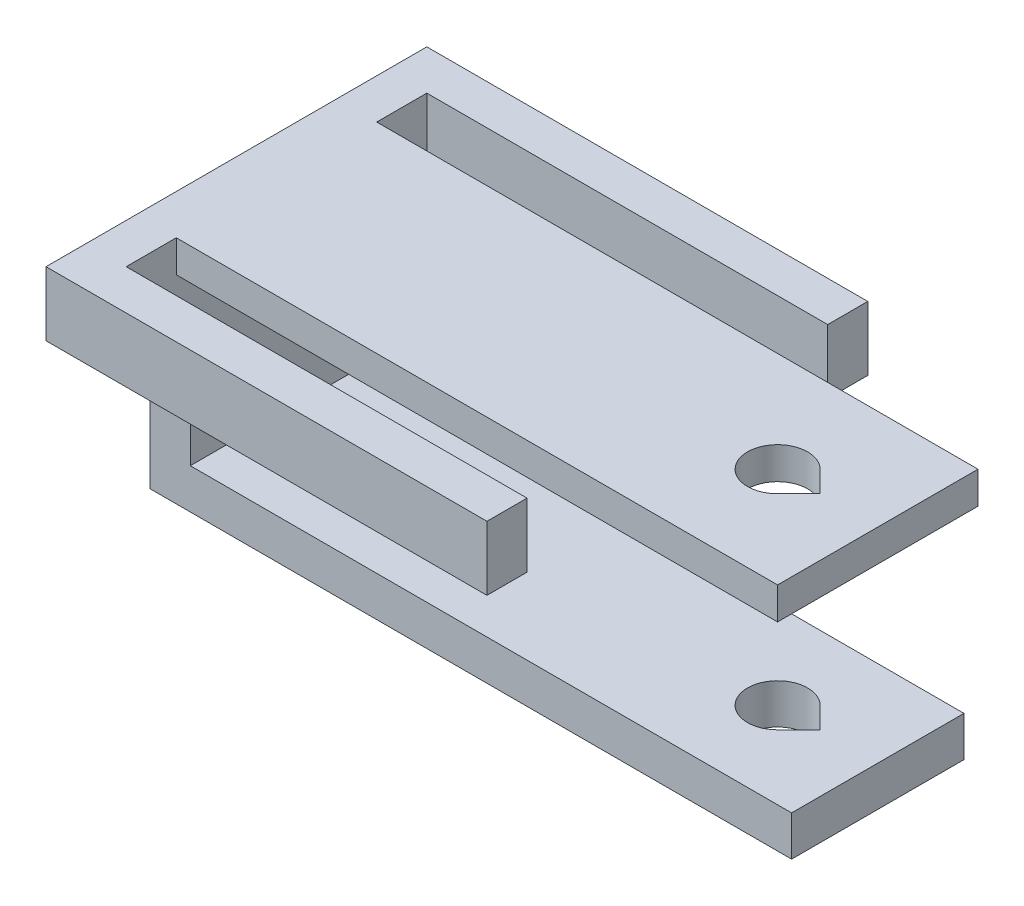
ISO-10303-21;
HEADER;
FILE_DESCRIPTION(('STEP AP214'),'2;1');
FILE_NAME('part.step','',(''),(''),'','','');
FILE_SCHEMA(('AUTOMOTIVE_DESIGN { 1 0 10303 214 1 1 1 1 }'));
ENDSEC;
DATA;
#1=APPLICATION_CONTEXT('core data for automotive mechanical design processes');
#2=APPLICATION_PROTOCOL_DEFINITION('international standard','automotive_design',2000,#1);
#3=PRODUCT_CONTEXT('',#1,'mechanical');
#4=PRODUCT('Part','Part','',(#3));
#5=PRODUCT_RELATED_PRODUCT_CATEGORY('part','',(#4));
#6=PRODUCT_DEFINITION_FORMATION('','',#4);
#7=PRODUCT_DEFINITION_CONTEXT('part definition',#1,'design');
#8=PRODUCT_DEFINITION('design','',#6,#7);
#9=PRODUCT_DEFINITION_SHAPE('','',#8);
#10=(LENGTH_UNIT() NAMED_UNIT(*) SI_UNIT(.MILLI.,.METRE.));
#11=(NAMED_UNIT(*) PLANE_ANGLE_UNIT() SI_UNIT($,.RADIAN.));
#12=(NAMED_UNIT(*) SI_UNIT($,.STERADIAN.) SOLID_ANGLE_UNIT());
#13=UNCERTAINTY_MEASURE_WITH_UNIT(LENGTH_MEASURE(1.E-05),#10,'distance_accuracy_value','');
#14=(GEOMETRIC_REPRESENTATION_CONTEXT(3) GLOBAL_UNCERTAINTY_ASSIGNED_CONTEXT((#13)) GLOBAL_UNIT_ASSIGNED_CONTEXT((#10,
#11,#12)) REPRESENTATION_CONTEXT('',''));
#15=CARTESIAN_POINT('',(0.,0.,0.));
#16=DIRECTION('',(0.,0.,1.));
#17=DIRECTION('',(1.,0.,0.));
#18=AXIS2_PLACEMENT_3D('',#15,#16,#17);
#19=CARTESIAN_POINT('',(0.,0.,0.));
#20=DIRECTION('',(-1.,0.,0.));
#21=DIRECTION('',(0.,0.,1.));
#22=AXIS2_PLACEMENT_3D('',#19,#20,#21);
#23=PLANE('',#22);
#24=DIRECTION('',(0.,0.,1.));
#25=VECTOR('',#24,1.);
#26=CARTESIAN_POINT('',(0.,-8.6,-0.700000000000001));
#27=LINE('',#26,#25);
#28=CARTESIAN_POINT('',(0.,-8.6,-9.3));
#29=VERTEX_POINT('',#28);
#30=CARTESIAN_POINT('',(0.,-8.6,-0.700000000000001));
#31=VERTEX_POINT('',#30);
#32=EDGE_CURVE('E261',#29,#31,#27,.T.);
#33=ORIENTED_EDGE('',*,*,#32,.F.);
#34=DIRECTION('',(0.,-1.,0.));
#35=VECTOR('',#34,1.);
#36=CARTESIAN_POINT('',(0.,-1.6,-9.3));
#37=LINE('',#36,#35);
#38=CARTESIAN_POINT('',(0.,-1.6,-9.3));
#39=VERTEX_POINT('',#38);
#40=EDGE_CURVE('E323',#39,#29,#37,.T.);
#41=ORIENTED_EDGE('',*,*,#40,.F.);
#42=DIRECTION('',(0.,0.,1.));
#43=VECTOR('',#42,1.);
#44=CARTESIAN_POINT('',(0.,-1.6,-14.5));
#45=LINE('',#44,#43);
#46=CARTESIAN_POINT('',(0.,-1.6,-12.5));
#47=VERTEX_POINT('',#46);
#48=EDGE_CURVE('E302',#47,#39,#45,.T.);
#49=ORIENTED_EDGE('',*,*,#48,.F.);
#50=DIRECTION('',(0.,-1.,0.));
#51=VECTOR('',#50,1.);
#52=CARTESIAN_POINT('',(0.,1.6,-12.5));
#53=LINE('',#52,#51);
#54=CARTESIAN_POINT('',(0.,1.6,-12.5));
#55=VERTEX_POINT('',#54);
#56=EDGE_CURVE('E268',#55,#47,#53,.T.);
#57=ORIENTED_EDGE('',*,*,#56,.F.);
#58=DIRECTION('',(0.,0.,-1.));
#59=VECTOR('',#58,1.);
#60=CARTESIAN_POINT('',(0.,1.6,-14.5));
#61=LINE('',#60,#59);
#62=CARTESIAN_POINT('',(0.,1.6,-10.));
#63=VERTEX_POINT('',#62);
#64=EDGE_CURVE('E331',#63,#55,#61,.T.);
#65=ORIENTED_EDGE('',*,*,#64,.F.);
#66=DIRECTION('',(0.,-1.,0.));
#67=VECTOR('',#66,1.);
#68=CARTESIAN_POINT('',(0.,1.6,-10.));
#69=LINE('',#68,#67);
#70=CARTESIAN_POINT('',(0.,0.,-10.));
#71=VERTEX_POINT('',#70);
#72=EDGE_CURVE('E362',#63,#71,#69,.T.);
#73=ORIENTED_EDGE('',*,*,#72,.T.);
#74=DIRECTION('',(0.,0.,-1.));
#75=VECTOR('',#74,1.);
#76=CARTESIAN_POINT('',(0.,0.,0.));
#77=LINE('',#76,#75);
#78=CARTESIAN_POINT('',(0.,0.,0.));
#79=VERTEX_POINT('',#78);
#80=EDGE_CURVE('E354',#79,#71,#77,.T.);
#81=ORIENTED_EDGE('',*,*,#80,.F.);
#82=DIRECTION('',(0.,-1.,0.));
#83=VECTOR('',#82,1.);
#84=CARTESIAN_POINT('',(0.,1.6,0.));
#85=LINE('',#84,#83);
#86=CARTESIAN_POINT('',(0.,1.6,0.));
#87=VERTEX_POINT('',#86);
#88=EDGE_CURVE('E356',#87,#79,#85,.T.);
#89=ORIENTED_EDGE('',*,*,#88,.F.);
#90=CARTESIAN_POINT('',(0.,1.6,2.5));
#91=VERTEX_POINT('',#90);
#92=EDGE_CURVE('E307',#91,#87,#61,.T.);
#93=ORIENTED_EDGE('',*,*,#92,.F.);
#94=DIRECTION('',(0.,1.,0.));
#95=VECTOR('',#94,1.);
#96=CARTESIAN_POINT('',(0.,1.6,2.5));
#97=LINE('',#96,#95);
#98=CARTESIAN_POINT('',(0.,-1.6,2.5));
#99=VERTEX_POINT('',#98);
#100=EDGE_CURVE('E285',#99,#91,#97,.T.);
#101=ORIENTED_EDGE('',*,*,#100,.F.);
#102=DIRECTION('',(0.,0.,1.));
#103=VECTOR('',#102,1.);
#104=CARTESIAN_POINT('',(0.,-1.6,-0.7));
#105=LINE('',#104,#103);
#106=CARTESIAN_POINT('',(0.,-1.6,-0.7));
#107=VERTEX_POINT('',#106);
#108=EDGE_CURVE('E328',#107,#99,#105,.T.);
#109=ORIENTED_EDGE('',*,*,#108,.F.);
#110=DIRECTION('',(0.,1.,0.));
#111=VECTOR('',#110,1.);
#112=CARTESIAN_POINT('',(0.,-10.6,-0.700000000000001));
#113=LINE('',#112,#111);
#114=EDGE_CURVE('E326',#31,#107,#113,.T.);
#115=ORIENTED_EDGE('',*,*,#114,.F.);
#116=EDGE_LOOP('',(#33,#41,#49,#57,#65,#73,#81,#89,#93,#101,#109,#115));
#117=FACE_BOUND('',#116,.T.);
#118=ADVANCED_FACE('F33',(#117),#23,.F.);
#119=CARTESIAN_POINT('',(0.,1.6,0.));
#120=DIRECTION('',(0.,0.,-1.));
#121=DIRECTION('',(-1.,0.,0.));
#122=AXIS2_PLACEMENT_3D('',#119,#120,#121);
#123=PLANE('',#122);
#124=DIRECTION('',(1.,0.,0.));
#125=VECTOR('',#124,1.);
#126=CARTESIAN_POINT('',(0.,0.,0.));
#127=LINE('',#126,#125);
#128=CARTESIAN_POINT('',(30.,0.,0.));
#129=VERTEX_POINT('',#128);
#130=EDGE_CURVE('E350',#79,#129,#127,.T.);
#131=ORIENTED_EDGE('',*,*,#130,.T.);
#132=DIRECTION('',(0.,-1.,0.));
#133=VECTOR('',#132,1.);
#134=CARTESIAN_POINT('',(30.,1.6,0.));
#135=LINE('',#134,#133);
#136=CARTESIAN_POINT('',(30.,1.6,0.));
#137=VERTEX_POINT('',#136);
#138=EDGE_CURVE('E243',#137,#129,#135,.T.);
#139=ORIENTED_EDGE('',*,*,#138,.F.);
#140=DIRECTION('',(1.,0.,0.));
#141=VECTOR('',#140,1.);
#142=CARTESIAN_POINT('',(0.,1.6,0.));
#143=LINE('',#142,#141);
#144=EDGE_CURVE('E351',#87,#137,#143,.T.);
#145=ORIENTED_EDGE('',*,*,#144,.F.);
#146=ORIENTED_EDGE('',*,*,#88,.T.);
#147=EDGE_LOOP('',(#131,#139,#145,#146));
#148=FACE_BOUND('',#147,.T.);
#149=ADVANCED_FACE('F35',(#148),#123,.F.);
#150=CARTESIAN_POINT('',(0.,1.6,-10.));
#151=DIRECTION('',(0.,0.,-1.));
#152=DIRECTION('',(-1.,0.,0.));
#153=AXIS2_PLACEMENT_3D('',#150,#151,#152);
#154=PLANE('',#153);
#155=DIRECTION('',(1.,0.,0.));
#156=VECTOR('',#155,1.);
#157=CARTESIAN_POINT('',(0.,0.,-10.));
#158=LINE('',#157,#156);
#159=CARTESIAN_POINT('',(30.,0.,-10.));
#160=VERTEX_POINT('',#159);
#161=EDGE_CURVE('E358',#71,#160,#158,.T.);
#162=ORIENTED_EDGE('',*,*,#161,.F.);
#163=ORIENTED_EDGE('',*,*,#72,.F.);
#164=DIRECTION('',(1.,0.,0.));
#165=VECTOR('',#164,1.);
#166=CARTESIAN_POINT('',(0.,1.6,-10.));
#167=LINE('',#166,#165);
#168=CARTESIAN_POINT('',(30.,1.6,-10.));
#169=VERTEX_POINT('',#168);
#170=EDGE_CURVE('E353',#63,#169,#167,.T.);
#171=ORIENTED_EDGE('',*,*,#170,.T.);
#172=DIRECTION('',(0.,1.,0.));
#173=VECTOR('',#172,1.);
#174=CARTESIAN_POINT('',(30.,1.6,-10.));
#175=LINE('',#174,#173);
#176=EDGE_CURVE('E237',#160,#169,#175,.T.);
#177=ORIENTED_EDGE('',*,*,#176,.F.);
#178=EDGE_LOOP('',(#162,#163,#171,#177));
#179=FACE_BOUND('',#178,.T.);
#180=ADVANCED_FACE('F389',(#179),#154,.T.);
#181=CARTESIAN_POINT('',(0.,1.6,0.));
#182=DIRECTION('',(0.,1.,0.));
#183=DIRECTION('',(0.,0.,1.));
#184=AXIS2_PLACEMENT_3D('',#181,#182,#183);
#185=PLANE('',#184);
#186=CARTESIAN_POINT('',(25.,1.6,-5.));
#187=DIRECTION('',(0.,1.,0.));
#188=DIRECTION('',(0.,0.,1.));
#189=AXIS2_PLACEMENT_3D('',#186,#187,#188);
#190=CIRCLE('',#189,1.5);
#191=CARTESIAN_POINT('',(26.0606601717798,1.6,-6.06066017177982));
#192=VERTEX_POINT('',#191);
#193=CARTESIAN_POINT('',(26.0606601717798,1.6,-3.93933982822018));
#194=VERTEX_POINT('',#193);
#195=EDGE_CURVE('E235',#192,#194,#190,.T.);
#196=ORIENTED_EDGE('',*,*,#195,.F.);
#197=DIRECTION('',(-0.707106781186543,0.,-0.707106781186552));
#198=VECTOR('',#197,1.);
#199=CARTESIAN_POINT('',(16.06066017178,1.6,-16.0606601717798));
#200=LINE('',#199,#198);
#201=CARTESIAN_POINT('',(27.1213203435596,1.6,-5.));
#202=VERTEX_POINT('',#201);
#203=EDGE_CURVE('E225',#202,#192,#200,.T.);
#204=ORIENTED_EDGE('',*,*,#203,.F.);
#205=DIRECTION('',(0.707106781186543,0.,-0.707106781186552));
#206=VECTOR('',#205,1.);
#207=CARTESIAN_POINT('',(11.06066017178,1.6,11.0606601717798));
#208=LINE('',#207,#206);
#209=EDGE_CURVE('E230',#194,#202,#208,.T.);
#210=ORIENTED_EDGE('',*,*,#209,.F.);
#211=EDGE_LOOP('',(#196,#204,#210));
#212=FACE_BOUND('',#211,.T.);
#213=ORIENTED_EDGE('',*,*,#144,.T.);
#214=DIRECTION('',(0.,0.,1.));
#215=VECTOR('',#214,1.);
#216=CARTESIAN_POINT('',(30.,1.6,-10.));
#217=LINE('',#216,#215);
#218=EDGE_CURVE('E240',#169,#137,#217,.T.);
#219=ORIENTED_EDGE('',*,*,#218,.F.);
#220=ORIENTED_EDGE('',*,*,#170,.F.);
#221=ORIENTED_EDGE('',*,*,#64,.T.);
#222=DIRECTION('',(-1.,0.,0.));
#223=VECTOR('',#222,1.);
#224=CARTESIAN_POINT('',(20.,1.6,-12.5));
#225=LINE('',#224,#223);
#226=CARTESIAN_POINT('',(20.,1.6,-12.5));
#227=VERTEX_POINT('',#226);
#228=EDGE_CURVE('E283',#227,#55,#225,.T.);
#229=ORIENTED_EDGE('',*,*,#228,.F.);
#230=DIRECTION('',(0.,0.,1.));
#231=VECTOR('',#230,1.);
#232=CARTESIAN_POINT('',(20.,1.6,-14.5));
#233=LINE('',#232,#231);
#234=CARTESIAN_POINT('',(20.,1.6,-14.5));
#235=VERTEX_POINT('',#234);
#236=EDGE_CURVE('E272',#235,#227,#233,.T.);
#237=ORIENTED_EDGE('',*,*,#236,.F.);
#238=DIRECTION('',(1.,0.,0.));
#239=VECTOR('',#238,1.);
#240=CARTESIAN_POINT('',(-2.,1.6,-14.5));
#241=LINE('',#240,#239);
#242=CARTESIAN_POINT('',(-2.,1.6,-14.5));
#243=VERTEX_POINT('',#242);
#244=EDGE_CURVE('E321',#243,#235,#241,.T.);
#245=ORIENTED_EDGE('',*,*,#244,.F.);
#246=DIRECTION('',(0.,0.,-1.));
#247=VECTOR('',#246,1.);
#248=CARTESIAN_POINT('',(-2.,1.6,-14.5));
#249=LINE('',#248,#247);
#250=CARTESIAN_POINT('',(-2.,1.6,4.5));
#251=VERTEX_POINT('',#250);
#252=EDGE_CURVE('E319',#251,#243,#249,.T.);
#253=ORIENTED_EDGE('',*,*,#252,.F.);
#254=DIRECTION('',(1.,0.,0.));
#255=VECTOR('',#254,1.);
#256=CARTESIAN_POINT('',(-2.,1.6,4.5));
#257=LINE('',#256,#255);
#258=CARTESIAN_POINT('',(20.,1.6,4.5));
#259=VERTEX_POINT('',#258);
#260=EDGE_CURVE('E334',#251,#259,#257,.T.);
#261=ORIENTED_EDGE('',*,*,#260,.T.);
#262=DIRECTION('',(0.,0.,1.));
#263=VECTOR('',#262,1.);
#264=CARTESIAN_POINT('',(20.,1.6,4.5));
#265=LINE('',#264,#263);
#266=CARTESIAN_POINT('',(20.,1.6,2.5));
#267=VERTEX_POINT('',#266);
#268=EDGE_CURVE('E293',#267,#259,#265,.T.);
#269=ORIENTED_EDGE('',*,*,#268,.F.);
#270=DIRECTION('',(-1.,0.,0.));
#271=VECTOR('',#270,1.);
#272=CARTESIAN_POINT('',(20.,1.6,2.5));
#273=LINE('',#272,#271);
#274=EDGE_CURVE('E296',#267,#91,#273,.T.);
#275=ORIENTED_EDGE('',*,*,#274,.T.);
#276=ORIENTED_EDGE('',*,*,#92,.T.);
#277=EDGE_LOOP('',(#213,#219,#220,#221,#229,#237,#245,#253,#261,#269,#275,#276));
#278=FACE_BOUND('',#277,.T.);
#279=ADVANCED_FACE('F423',(#212,#278),#185,.T.);
#280=CARTESIAN_POINT('',(0.,0.,0.));
#281=DIRECTION('',(0.,1.,0.));
#282=DIRECTION('',(0.,0.,1.));
#283=AXIS2_PLACEMENT_3D('',#280,#281,#282);
#284=PLANE('',#283);
#285=DIRECTION('',(-0.707106781186543,0.,-0.707106781186552));
#286=VECTOR('',#285,1.);
#287=CARTESIAN_POINT('',(16.06066017178,0.,-16.0606601717798));
#288=LINE('',#287,#286);
#289=CARTESIAN_POINT('',(27.1213203435596,0.,-5.));
#290=VERTEX_POINT('',#289);
#291=CARTESIAN_POINT('',(26.0606601717798,0.,-6.06066017177982));
#292=VERTEX_POINT('',#291);
#293=EDGE_CURVE('E222',#290,#292,#288,.T.);
#294=ORIENTED_EDGE('',*,*,#293,.T.);
#295=CARTESIAN_POINT('',(25.,0.,-5.));
#296=DIRECTION('',(0.,1.,0.));
#297=DIRECTION('',(0.,0.,1.));
#298=AXIS2_PLACEMENT_3D('',#295,#296,#297);
#299=CIRCLE('',#298,1.5);
#300=CARTESIAN_POINT('',(26.0606601717798,0.,-3.93933982822018));
#301=VERTEX_POINT('',#300);
#302=EDGE_CURVE('E232',#292,#301,#299,.T.);
#303=ORIENTED_EDGE('',*,*,#302,.T.);
#304=DIRECTION('',(0.707106781186543,0.,-0.707106781186552));
#305=VECTOR('',#304,1.);
#306=CARTESIAN_POINT('',(11.06066017178,0.,11.0606601717798));
#307=LINE('',#306,#305);
#308=EDGE_CURVE('E227',#301,#290,#307,.T.);
#309=ORIENTED_EDGE('',*,*,#308,.T.);
#310=EDGE_LOOP('',(#294,#303,#309));
#311=FACE_BOUND('',#310,.T.);
#312=ORIENTED_EDGE('',*,*,#130,.F.);
#313=ORIENTED_EDGE('',*,*,#80,.T.);
#314=ORIENTED_EDGE('',*,*,#161,.T.);
#315=DIRECTION('',(0.,0.,-1.));
#316=VECTOR('',#315,1.);
#317=CARTESIAN_POINT('',(30.,0.,-10.));
#318=LINE('',#317,#316);
#319=EDGE_CURVE('E246',#129,#160,#318,.T.);
#320=ORIENTED_EDGE('',*,*,#319,.F.);
#321=EDGE_LOOP('',(#312,#313,#314,#320));
#322=FACE_BOUND('',#321,.T.);
#323=ADVANCED_FACE('F421',(#311,#322),#284,.F.);
#324=CARTESIAN_POINT('',(-2.,1.6,-14.5));
#325=DIRECTION('',(0.,0.,1.));
#326=DIRECTION('',(1.,0.,0.));
#327=AXIS2_PLACEMENT_3D('',#324,#325,#326);
#328=PLANE('',#327);
#329=ORIENTED_EDGE('',*,*,#244,.T.);
#330=DIRECTION('',(0.,1.,0.));
#331=VECTOR('',#330,1.);
#332=CARTESIAN_POINT('',(20.,1.6,-14.5));
#333=LINE('',#332,#331);
#334=CARTESIAN_POINT('',(20.,-1.6,-14.5));
#335=VERTEX_POINT('',#334);
#336=EDGE_CURVE('E269',#335,#235,#333,.T.);
#337=ORIENTED_EDGE('',*,*,#336,.F.);
#338=DIRECTION('',(1.,0.,0.));
#339=VECTOR('',#338,1.);
#340=CARTESIAN_POINT('',(-2.,-1.6,-14.5));
#341=LINE('',#340,#339);
#342=CARTESIAN_POINT('',(-2.,-1.6,-14.5));
#343=VERTEX_POINT('',#342);
#344=EDGE_CURVE('E348',#343,#335,#341,.T.);
#345=ORIENTED_EDGE('',*,*,#344,.F.);
#346=DIRECTION('',(0.,-1.,0.));
#347=VECTOR('',#346,1.);
#348=CARTESIAN_POINT('',(-2.,1.6,-14.5));
#349=LINE('',#348,#347);
#350=EDGE_CURVE('E303',#243,#343,#349,.T.);
#351=ORIENTED_EDGE('',*,*,#350,.F.);
#352=EDGE_LOOP('',(#329,#337,#345,#351));
#353=FACE_BOUND('',#352,.T.);
#354=ADVANCED_FACE('F417',(#353),#328,.F.);
#355=CARTESIAN_POINT('',(-2.,-1.6,-14.5));
#356=DIRECTION('',(0.,1.,0.));
#357=DIRECTION('',(0.,0.,1.));
#358=AXIS2_PLACEMENT_3D('',#355,#356,#357);
#359=PLANE('',#358);
#360=ORIENTED_EDGE('',*,*,#344,.T.);
#361=DIRECTION('',(0.,0.,-1.));
#362=VECTOR('',#361,1.);
#363=CARTESIAN_POINT('',(20.,-1.6,-14.5));
#364=LINE('',#363,#362);
#365=CARTESIAN_POINT('',(20.,-1.6,-12.5));
#366=VERTEX_POINT('',#365);
#367=EDGE_CURVE('E276',#366,#335,#364,.T.);
#368=ORIENTED_EDGE('',*,*,#367,.F.);
#369=DIRECTION('',(-1.,0.,0.));
#370=VECTOR('',#369,1.);
#371=CARTESIAN_POINT('',(20.,-1.6,-12.5));
#372=LINE('',#371,#370);
#373=EDGE_CURVE('E279',#366,#47,#372,.T.);
#374=ORIENTED_EDGE('',*,*,#373,.T.);
#375=ORIENTED_EDGE('',*,*,#48,.T.);
#376=DIRECTION('',(1.,0.,0.));
#377=VECTOR('',#376,1.);
#378=CARTESIAN_POINT('',(-2.,-1.6,-9.3));
#379=LINE('',#378,#377);
#380=CARTESIAN_POINT('',(-2.,-1.6,-9.3));
#381=VERTEX_POINT('',#380);
#382=EDGE_CURVE('E345',#381,#39,#379,.T.);
#383=ORIENTED_EDGE('',*,*,#382,.F.);
#384=DIRECTION('',(0.,0.,1.));
#385=VECTOR('',#384,1.);
#386=CARTESIAN_POINT('',(-2.,-1.6,-14.5));
#387=LINE('',#386,#385);
#388=EDGE_CURVE('E306',#343,#381,#387,.T.);
#389=ORIENTED_EDGE('',*,*,#388,.F.);
#390=EDGE_LOOP('',(#360,#368,#374,#375,#383,#389));
#391=FACE_BOUND('',#390,.T.);
#392=ADVANCED_FACE('F413',(#391),#359,.F.);
#393=CARTESIAN_POINT('',(-2.,-1.6,-9.3));
#394=DIRECTION('',(0.,0.,1.));
#395=DIRECTION('',(0.,-1.,0.));
#396=AXIS2_PLACEMENT_3D('',#393,#394,#395);
#397=PLANE('',#396);
#398=ORIENTED_EDGE('',*,*,#40,.T.);
#399=DIRECTION('',(-1.,0.,0.));
#400=VECTOR('',#399,1.);
#401=CARTESIAN_POINT('',(20.,-8.6,-9.3));
#402=LINE('',#401,#400);
#403=CARTESIAN_POINT('',(30.,-8.6,-9.3));
#404=VERTEX_POINT('',#403);
#405=EDGE_CURVE('E266',#404,#29,#402,.T.);
#406=ORIENTED_EDGE('',*,*,#405,.F.);
#407=DIRECTION('',(0.,1.,0.));
#408=VECTOR('',#407,1.);
#409=CARTESIAN_POINT('',(30.,-8.6,-9.3));
#410=LINE('',#409,#408);
#411=CARTESIAN_POINT('',(30.,-10.6,-9.3));
#412=VERTEX_POINT('',#411);
#413=EDGE_CURVE('E255',#412,#404,#410,.T.);
#414=ORIENTED_EDGE('',*,*,#413,.F.);
#415=DIRECTION('',(1.,0.,0.));
#416=VECTOR('',#415,1.);
#417=CARTESIAN_POINT('',(-2.,-10.6,-9.3));
#418=LINE('',#417,#416);
#419=CARTESIAN_POINT('',(-2.,-10.6,-9.3));
#420=VERTEX_POINT('',#419);
#421=EDGE_CURVE('E343',#420,#412,#418,.T.);
#422=ORIENTED_EDGE('',*,*,#421,.F.);
#423=DIRECTION('',(0.,-1.,0.));
#424=VECTOR('',#423,1.);
#425=CARTESIAN_POINT('',(-2.,-1.6,-9.3));
#426=LINE('',#425,#424);
#427=EDGE_CURVE('E309',#381,#420,#426,.T.);
#428=ORIENTED_EDGE('',*,*,#427,.F.);
#429=ORIENTED_EDGE('',*,*,#382,.T.);
#430=EDGE_LOOP('',(#398,#406,#414,#422,#428,#429));
#431=FACE_BOUND('',#430,.T.);
#432=ADVANCED_FACE('F410',(#431),#397,.F.);
#433=CARTESIAN_POINT('',(-2.,-10.6,-9.3));
#434=DIRECTION('',(0.,1.,0.));
#435=DIRECTION('',(0.,0.,1.));
#436=AXIS2_PLACEMENT_3D('',#433,#434,#435);
#437=PLANE('',#436);
#438=DIRECTION('',(0.707106781186543,0.,0.707106781186552));
#439=VECTOR('',#438,1.);
#440=CARTESIAN_POINT('',(26.0606601717798,-10.6,-6.06066017177982));
#441=LINE('',#440,#439);
#442=CARTESIAN_POINT('',(26.0606601717798,-10.6,-6.06066017177981));
#443=VERTEX_POINT('',#442);
#444=CARTESIAN_POINT('',(27.1213203435596,-10.6,-5.));
#445=VERTEX_POINT('',#444);
#446=EDGE_CURVE('E206',#443,#445,#441,.T.);
#447=ORIENTED_EDGE('',*,*,#446,.F.);
#448=CARTESIAN_POINT('',(25.,-10.6,-5.));
#449=DIRECTION('',(0.,-1.,0.));
#450=DIRECTION('',(0.,0.,-1.));
#451=AXIS2_PLACEMENT_3D('',#448,#449,#450);
#452=CIRCLE('',#451,1.5);
#453=CARTESIAN_POINT('',(26.0606601717798,-10.6,-3.93933982822018));
#454=VERTEX_POINT('',#453);
#455=EDGE_CURVE('E211',#454,#443,#452,.T.);
#456=ORIENTED_EDGE('',*,*,#455,.F.);
#457=DIRECTION('',(-0.707106781186543,0.,0.707106781186552));
#458=VECTOR('',#457,1.);
#459=CARTESIAN_POINT('',(27.1213203435596,-10.6,-5.));
#460=LINE('',#459,#458);
#461=EDGE_CURVE('E198',#445,#454,#460,.T.);
#462=ORIENTED_EDGE('',*,*,#461,.F.);
#463=EDGE_LOOP('',(#447,#456,#462));
#464=FACE_BOUND('',#463,.T.);
#465=ORIENTED_EDGE('',*,*,#421,.T.);
#466=DIRECTION('',(0.,0.,-1.));
#467=VECTOR('',#466,1.);
#468=CARTESIAN_POINT('',(30.,-10.6,-0.700000000000001));
#469=LINE('',#468,#467);
#470=CARTESIAN_POINT('',(30.,-10.6,-0.700000000000001));
#471=VERTEX_POINT('',#470);
#472=EDGE_CURVE('E252',#471,#412,#469,.T.);
#473=ORIENTED_EDGE('',*,*,#472,.F.);
#474=DIRECTION('',(1.,0.,0.));
#475=VECTOR('',#474,1.);
#476=CARTESIAN_POINT('',(-2.,-10.6,-0.700000000000001));
#477=LINE('',#476,#475);
#478=CARTESIAN_POINT('',(-2.,-10.6,-0.700000000000001));
#479=VERTEX_POINT('',#478);
#480=EDGE_CURVE('E341',#479,#471,#477,.T.);
#481=ORIENTED_EDGE('',*,*,#480,.F.);
#482=DIRECTION('',(0.,0.,1.));
#483=VECTOR('',#482,1.);
#484=CARTESIAN_POINT('',(-2.,-10.6,-9.3));
#485=LINE('',#484,#483);
#486=EDGE_CURVE('E311',#420,#479,#485,.T.);
#487=ORIENTED_EDGE('',*,*,#486,.F.);
#488=EDGE_LOOP('',(#465,#473,#481,#487));
#489=FACE_BOUND('',#488,.T.);
#490=ADVANCED_FACE('F213',(#464,#489),#437,.F.);
#491=CARTESIAN_POINT('',(-2.,-10.6,-0.700000000000001));
#492=DIRECTION('',(0.,0.,-1.));
#493=DIRECTION('',(0.,1.,0.));
#494=AXIS2_PLACEMENT_3D('',#491,#492,#493);
#495=PLANE('',#494);
#496=ORIENTED_EDGE('',*,*,#480,.T.);
#497=DIRECTION('',(0.,-1.,0.));
#498=VECTOR('',#497,1.);
#499=CARTESIAN_POINT('',(30.,-8.6,-0.700000000000001));
#500=LINE('',#499,#498);
#501=CARTESIAN_POINT('',(30.,-8.6,-0.700000000000001));
#502=VERTEX_POINT('',#501);
#503=EDGE_CURVE('E249',#502,#471,#500,.T.);
#504=ORIENTED_EDGE('',*,*,#503,.F.);
#505=DIRECTION('',(-1.,0.,0.));
#506=VECTOR('',#505,1.);
#507=CARTESIAN_POINT('',(20.,-8.6,-0.700000000000001));
#508=LINE('',#507,#506);
#509=EDGE_CURVE('E264',#502,#31,#508,.T.);
#510=ORIENTED_EDGE('',*,*,#509,.T.);
#511=ORIENTED_EDGE('',*,*,#114,.T.);
#512=DIRECTION('',(1.,0.,0.));
#513=VECTOR('',#512,1.);
#514=CARTESIAN_POINT('',(-2.,-1.6,-0.7));
#515=LINE('',#514,#513);
#516=CARTESIAN_POINT('',(-2.,-1.6,-0.7));
#517=VERTEX_POINT('',#516);
#518=EDGE_CURVE('E338',#517,#107,#515,.T.);
#519=ORIENTED_EDGE('',*,*,#518,.F.);
#520=DIRECTION('',(0.,1.,0.));
#521=VECTOR('',#520,1.);
#522=CARTESIAN_POINT('',(-2.,-10.6,-0.700000000000001));
#523=LINE('',#522,#521);
#524=EDGE_CURVE('E313',#479,#517,#523,.T.);
#525=ORIENTED_EDGE('',*,*,#524,.F.);
#526=EDGE_LOOP('',(#496,#504,#510,#511,#519,#525));
#527=FACE_BOUND('',#526,.T.);
#528=ADVANCED_FACE('F403',(#527),#495,.F.);
#529=CARTESIAN_POINT('',(-2.,-1.6,-0.7));
#530=DIRECTION('',(0.,1.,0.));
#531=DIRECTION('',(0.,0.,1.));
#532=AXIS2_PLACEMENT_3D('',#529,#530,#531);
#533=PLANE('',#532);
#534=ORIENTED_EDGE('',*,*,#108,.T.);
#535=DIRECTION('',(-1.,0.,0.));
#536=VECTOR('',#535,1.);
#537=CARTESIAN_POINT('',(20.,-1.6,2.5));
#538=LINE('',#537,#536);
#539=CARTESIAN_POINT('',(20.,-1.6,2.5));
#540=VERTEX_POINT('',#539);
#541=EDGE_CURVE('E300',#540,#99,#538,.T.);
#542=ORIENTED_EDGE('',*,*,#541,.F.);
#543=DIRECTION('',(0.,0.,-1.));
#544=VECTOR('',#543,1.);
#545=CARTESIAN_POINT('',(20.,-1.6,4.5));
#546=LINE('',#545,#544);
#547=CARTESIAN_POINT('',(20.,-1.6,4.5));
#548=VERTEX_POINT('',#547);
#549=EDGE_CURVE('E289',#548,#540,#546,.T.);
#550=ORIENTED_EDGE('',*,*,#549,.F.);
#551=DIRECTION('',(1.,0.,0.));
#552=VECTOR('',#551,1.);
#553=CARTESIAN_POINT('',(-2.,-1.6,4.5));
#554=LINE('',#553,#552);
#555=CARTESIAN_POINT('',(-2.,-1.6,4.5));
#556=VERTEX_POINT('',#555);
#557=EDGE_CURVE('E336',#556,#548,#554,.T.);
#558=ORIENTED_EDGE('',*,*,#557,.F.);
#559=DIRECTION('',(0.,0.,1.));
#560=VECTOR('',#559,1.);
#561=CARTESIAN_POINT('',(-2.,-1.6,-0.7));
#562=LINE('',#561,#560);
#563=EDGE_CURVE('E315',#517,#556,#562,.T.);
#564=ORIENTED_EDGE('',*,*,#563,.F.);
#565=ORIENTED_EDGE('',*,*,#518,.T.);
#566=EDGE_LOOP('',(#534,#542,#550,#558,#564,#565));
#567=FACE_BOUND('',#566,.T.);
#568=ADVANCED_FACE('F399',(#567),#533,.F.);
#569=CARTESIAN_POINT('',(-2.,1.6,4.5));
#570=DIRECTION('',(0.,0.,-1.));
#571=DIRECTION('',(0.,1.,0.));
#572=AXIS2_PLACEMENT_3D('',#569,#570,#571);
#573=PLANE('',#572);
#574=ORIENTED_EDGE('',*,*,#557,.T.);
#575=DIRECTION('',(0.,-1.,0.));
#576=VECTOR('',#575,1.);
#577=CARTESIAN_POINT('',(20.,1.6,4.5));
#578=LINE('',#577,#576);
#579=EDGE_CURVE('E286',#259,#548,#578,.T.);
#580=ORIENTED_EDGE('',*,*,#579,.F.);
#581=ORIENTED_EDGE('',*,*,#260,.F.);
#582=DIRECTION('',(0.,1.,0.));
#583=VECTOR('',#582,1.);
#584=CARTESIAN_POINT('',(-2.,1.6,4.5));
#585=LINE('',#584,#583);
#586=EDGE_CURVE('E317',#556,#251,#585,.T.);
#587=ORIENTED_EDGE('',*,*,#586,.F.);
#588=EDGE_LOOP('',(#574,#580,#581,#587));
#589=FACE_BOUND('',#588,.T.);
#590=ADVANCED_FACE('F396',(#589),#573,.F.);
#591=CARTESIAN_POINT('',(-2.,0.,0.));
#592=DIRECTION('',(-1.,0.,0.));
#593=DIRECTION('',(0.,0.,1.));
#594=AXIS2_PLACEMENT_3D('',#591,#592,#593);
#595=PLANE('',#594);
#596=ORIENTED_EDGE('',*,*,#350,.T.);
#597=ORIENTED_EDGE('',*,*,#388,.T.);
#598=ORIENTED_EDGE('',*,*,#427,.T.);
#599=ORIENTED_EDGE('',*,*,#486,.T.);
#600=ORIENTED_EDGE('',*,*,#524,.T.);
#601=ORIENTED_EDGE('',*,*,#563,.T.);
#602=ORIENTED_EDGE('',*,*,#586,.T.);
#603=ORIENTED_EDGE('',*,*,#252,.T.);
#604=EDGE_LOOP('',(#596,#597,#598,#599,#600,#601,#602,#603));
#605=FACE_BOUND('',#604,.T.);
#606=ADVANCED_FACE('F394',(#605),#595,.T.);
#607=CARTESIAN_POINT('',(20.,1.6,2.5));
#608=DIRECTION('',(0.,0.,1.));
#609=DIRECTION('',(0.,-1.,0.));
#610=AXIS2_PLACEMENT_3D('',#607,#608,#609);
#611=PLANE('',#610);
#612=ORIENTED_EDGE('',*,*,#100,.T.);
#613=ORIENTED_EDGE('',*,*,#274,.F.);
#614=DIRECTION('',(0.,1.,0.));
#615=VECTOR('',#614,1.);
#616=CARTESIAN_POINT('',(20.,1.6,2.5));
#617=LINE('',#616,#615);
#618=EDGE_CURVE('E291',#540,#267,#617,.T.);
#619=ORIENTED_EDGE('',*,*,#618,.F.);
#620=ORIENTED_EDGE('',*,*,#541,.T.);
#621=EDGE_LOOP('',(#612,#613,#619,#620));
#622=FACE_BOUND('',#621,.T.);
#623=ADVANCED_FACE('F461',(#622),#611,.F.);
#624=CARTESIAN_POINT('',(20.,0.,0.));
#625=DIRECTION('',(1.,0.,0.));
#626=DIRECTION('',(0.,0.,-1.));
#627=AXIS2_PLACEMENT_3D('',#624,#625,#626);
#628=PLANE('',#627);
#629=ORIENTED_EDGE('',*,*,#579,.T.);
#630=ORIENTED_EDGE('',*,*,#549,.T.);
#631=ORIENTED_EDGE('',*,*,#618,.T.);
#632=ORIENTED_EDGE('',*,*,#268,.T.);
#633=EDGE_LOOP('',(#629,#630,#631,#632));
#634=FACE_BOUND('',#633,.T.);
#635=ADVANCED_FACE('F497',(#634),#628,.T.);
#636=CARTESIAN_POINT('',(20.,1.6,-12.5));
#637=DIRECTION('',(0.,0.,-1.));
#638=DIRECTION('',(-1.,0.,0.));
#639=AXIS2_PLACEMENT_3D('',#636,#637,#638);
#640=PLANE('',#639);
#641=ORIENTED_EDGE('',*,*,#56,.T.);
#642=ORIENTED_EDGE('',*,*,#373,.F.);
#643=DIRECTION('',(0.,-1.,0.));
#644=VECTOR('',#643,1.);
#645=CARTESIAN_POINT('',(20.,1.6,-12.5));
#646=LINE('',#645,#644);
#647=EDGE_CURVE('E274',#227,#366,#646,.T.);
#648=ORIENTED_EDGE('',*,*,#647,.F.);
#649=ORIENTED_EDGE('',*,*,#228,.T.);
#650=EDGE_LOOP('',(#641,#642,#648,#649));
#651=FACE_BOUND('',#650,.T.);
#652=ADVANCED_FACE('F487',(#651),#640,.F.);
#653=CARTESIAN_POINT('',(20.,0.,0.));
#654=DIRECTION('',(-1.,0.,0.));
#655=DIRECTION('',(0.,0.,1.));
#656=AXIS2_PLACEMENT_3D('',#653,#654,#655);
#657=PLANE('',#656);
#658=ORIENTED_EDGE('',*,*,#336,.T.);
#659=ORIENTED_EDGE('',*,*,#236,.T.);
#660=ORIENTED_EDGE('',*,*,#647,.T.);
#661=ORIENTED_EDGE('',*,*,#367,.T.);
#662=EDGE_LOOP('',(#658,#659,#660,#661));
#663=FACE_BOUND('',#662,.T.);
#664=ADVANCED_FACE('F489',(#663),#657,.F.);
#665=CARTESIAN_POINT('',(20.,-8.6,-0.700000000000001));
#666=DIRECTION('',(0.,-1.,0.));
#667=DIRECTION('',(0.,0.,-1.));
#668=AXIS2_PLACEMENT_3D('',#665,#666,#667);
#669=PLANE('',#668);
#670=DIRECTION('',(-0.707106781186543,0.,0.707106781186552));
#671=VECTOR('',#670,1.);
#672=CARTESIAN_POINT('',(21.4106601717799,-8.6,0.710660171779839));
#673=LINE('',#672,#671);
#674=CARTESIAN_POINT('',(27.1213203435596,-8.6,-5.));
#675=VERTEX_POINT('',#674);
#676=CARTESIAN_POINT('',(26.0606601717798,-8.6,-3.93933982822018));
#677=VERTEX_POINT('',#676);
#678=EDGE_CURVE('E41',#675,#677,#673,.T.);
#679=ORIENTED_EDGE('',*,*,#678,.T.);
#680=CARTESIAN_POINT('',(25.,-8.6,-5.));
#681=DIRECTION('',(0.,-1.,0.));
#682=DIRECTION('',(0.,0.,-1.));
#683=AXIS2_PLACEMENT_3D('',#680,#681,#682);
#684=CIRCLE('',#683,1.5);
#685=CARTESIAN_POINT('',(26.0606601717798,-8.6,-6.06066017177982));
#686=VERTEX_POINT('',#685);
#687=EDGE_CURVE('E11',#677,#686,#684,.T.);
#688=ORIENTED_EDGE('',*,*,#687,.T.);
#689=DIRECTION('',(0.707106781186543,0.,0.707106781186552));
#690=VECTOR('',#689,1.);
#691=CARTESIAN_POINT('',(25.7106601717799,-8.6,-6.41066017177978));
#692=LINE('',#691,#690);
#693=EDGE_CURVE('E365',#686,#675,#692,.T.);
#694=ORIENTED_EDGE('',*,*,#693,.T.);
#695=EDGE_LOOP('',(#679,#688,#694));
#696=FACE_BOUND('',#695,.T.);
#697=ORIENTED_EDGE('',*,*,#32,.T.);
#698=ORIENTED_EDGE('',*,*,#509,.F.);
#699=DIRECTION('',(0.,0.,1.));
#700=VECTOR('',#699,1.);
#701=CARTESIAN_POINT('',(30.,-8.6,-0.700000000000001));
#702=LINE('',#701,#700);
#703=EDGE_CURVE('E258',#404,#502,#702,.T.);
#704=ORIENTED_EDGE('',*,*,#703,.F.);
#705=ORIENTED_EDGE('',*,*,#405,.T.);
#706=EDGE_LOOP('',(#697,#698,#704,#705));
#707=FACE_BOUND('',#706,.T.);
#708=ADVANCED_FACE('F367',(#696,#707),#669,.F.);
#709=CARTESIAN_POINT('',(30.,0.,0.));
#710=DIRECTION('',(1.,0.,0.));
#711=DIRECTION('',(0.,0.,-1.));
#712=AXIS2_PLACEMENT_3D('',#709,#710,#711);
#713=PLANE('',#712);
#714=ORIENTED_EDGE('',*,*,#503,.T.);
#715=ORIENTED_EDGE('',*,*,#472,.T.);
#716=ORIENTED_EDGE('',*,*,#413,.T.);
#717=ORIENTED_EDGE('',*,*,#703,.T.);
#718=EDGE_LOOP('',(#714,#715,#716,#717));
#719=FACE_BOUND('',#718,.T.);
#720=ADVANCED_FACE('F475',(#719),#713,.T.);
#721=CARTESIAN_POINT('',(30.,0.,0.));
#722=DIRECTION('',(-1.,0.,0.));
#723=DIRECTION('',(0.,0.,1.));
#724=AXIS2_PLACEMENT_3D('',#721,#722,#723);
#725=PLANE('',#724);
#726=ORIENTED_EDGE('',*,*,#176,.T.);
#727=ORIENTED_EDGE('',*,*,#218,.T.);
#728=ORIENTED_EDGE('',*,*,#138,.T.);
#729=ORIENTED_EDGE('',*,*,#319,.T.);
#730=EDGE_LOOP('',(#726,#727,#728,#729));
#731=FACE_BOUND('',#730,.T.);
#732=ADVANCED_FACE('F452',(#731),#725,.F.);
#733=CARTESIAN_POINT('',(26.0606601717798,4.4,-6.06066017177982));
#734=DIRECTION('',(0.707106781186552,0.,-0.707106781186543));
#735=DIRECTION('',(-0.707106781186543,0.,-0.707106781186552));
#736=AXIS2_PLACEMENT_3D('',#733,#734,#735);
#737=PLANE('',#736);
#738=DIRECTION('',(0.,-1.,0.));
#739=VECTOR('',#738,1.);
#740=CARTESIAN_POINT('',(26.0606601717798,4.4,-6.06066017177982));
#741=LINE('',#740,#739);
#742=EDGE_CURVE('E209',#686,#443,#741,.T.);
#743=ORIENTED_EDGE('',*,*,#742,.T.);
#744=ORIENTED_EDGE('',*,*,#446,.T.);
#745=DIRECTION('',(0.,-1.,0.));
#746=VECTOR('',#745,1.);
#747=CARTESIAN_POINT('',(27.1213203435596,4.4,-5.));
#748=LINE('',#747,#746);
#749=EDGE_CURVE('E193',#675,#445,#748,.T.);
#750=ORIENTED_EDGE('',*,*,#749,.F.);
#751=ORIENTED_EDGE('',*,*,#693,.F.);
#752=EDGE_LOOP('',(#743,#744,#750,#751));
#753=FACE_BOUND('',#752,.T.);
#754=ADVANCED_FACE('F207',(#753),#737,.F.);
#755=CARTESIAN_POINT('',(27.1213203435596,4.4,-5.));
#756=DIRECTION('',(0.707106781186552,0.,0.707106781186543));
#757=DIRECTION('',(0.707106781186543,0.,-0.707106781186552));
#758=AXIS2_PLACEMENT_3D('',#755,#756,#757);
#759=PLANE('',#758);
#760=ORIENTED_EDGE('',*,*,#749,.T.);
#761=ORIENTED_EDGE('',*,*,#461,.T.);
#762=DIRECTION('',(0.,-1.,0.));
#763=VECTOR('',#762,1.);
#764=CARTESIAN_POINT('',(26.0606601717798,4.4,-3.93933982822018));
#765=LINE('',#764,#763);
#766=EDGE_CURVE('E219',#677,#454,#765,.T.);
#767=ORIENTED_EDGE('',*,*,#766,.F.);
#768=ORIENTED_EDGE('',*,*,#678,.F.);
#769=EDGE_LOOP('',(#760,#761,#767,#768));
#770=FACE_BOUND('',#769,.T.);
#771=ADVANCED_FACE('F195',(#770),#759,.F.);
#772=CARTESIAN_POINT('',(25.,4.4,-5.));
#773=DIRECTION('',(0.,-1.,0.));
#774=DIRECTION('',(0.,0.,-1.));
#775=AXIS2_PLACEMENT_3D('',#772,#773,#774);
#776=CYLINDRICAL_SURFACE('',#775,1.5);
#777=ORIENTED_EDGE('',*,*,#766,.T.);
#778=ORIENTED_EDGE('',*,*,#455,.T.);
#779=ORIENTED_EDGE('',*,*,#742,.F.);
#780=ORIENTED_EDGE('',*,*,#687,.F.);
#781=EDGE_LOOP('',(#777,#778,#779,#780));
#782=FACE_BOUND('',#781,.T.);
#783=ADVANCED_FACE('F370',(#782),#776,.F.);
#784=ORIENTED_EDGE('',*,*,#195,.T.);
#785=EDGE_CURVE('E220',#194,#301,#765,.T.);
#786=ORIENTED_EDGE('',*,*,#785,.T.);
#787=ORIENTED_EDGE('',*,*,#302,.F.);
#788=EDGE_CURVE('E53',#192,#292,#741,.T.);
#789=ORIENTED_EDGE('',*,*,#788,.F.);
#790=EDGE_LOOP('',(#784,#786,#787,#789));
#791=FACE_BOUND('',#790,.T.);
#792=ADVANCED_FACE('F372',(#791),#776,.F.);
#793=ORIENTED_EDGE('',*,*,#209,.T.);
#794=EDGE_CURVE('E48',#202,#290,#748,.T.);
#795=ORIENTED_EDGE('',*,*,#794,.T.);
#796=ORIENTED_EDGE('',*,*,#308,.F.);
#797=ORIENTED_EDGE('',*,*,#785,.F.);
#798=EDGE_LOOP('',(#793,#795,#796,#797));
#799=FACE_BOUND('',#798,.T.);
#800=ADVANCED_FACE('F378',(#799),#759,.F.);
#801=ORIENTED_EDGE('',*,*,#203,.T.);
#802=ORIENTED_EDGE('',*,*,#788,.T.);
#803=ORIENTED_EDGE('',*,*,#293,.F.);
#804=ORIENTED_EDGE('',*,*,#794,.F.);
#805=EDGE_LOOP('',(#801,#802,#803,#804));
#806=FACE_BOUND('',#805,.T.);
#807=ADVANCED_FACE('F515',(#806),#737,.F.);
#808=CLOSED_SHELL('',(#118,#149,#180,#279,#323,#354,#392,#432,#490,#528,#568,#590,#606,#623,
#635,#652,#664,#708,#720,#732,#754,#771,#783,#792,#800,#807));
#809=MANIFOLD_SOLID_BREP('B2',#808);
#810=ADVANCED_BREP_SHAPE_REPRESENTATION('',(#18,#809),#14);
#811=SHAPE_DEFINITION_REPRESENTATION(#9,#810);
ENDSEC;
END-ISO-10303-21;
